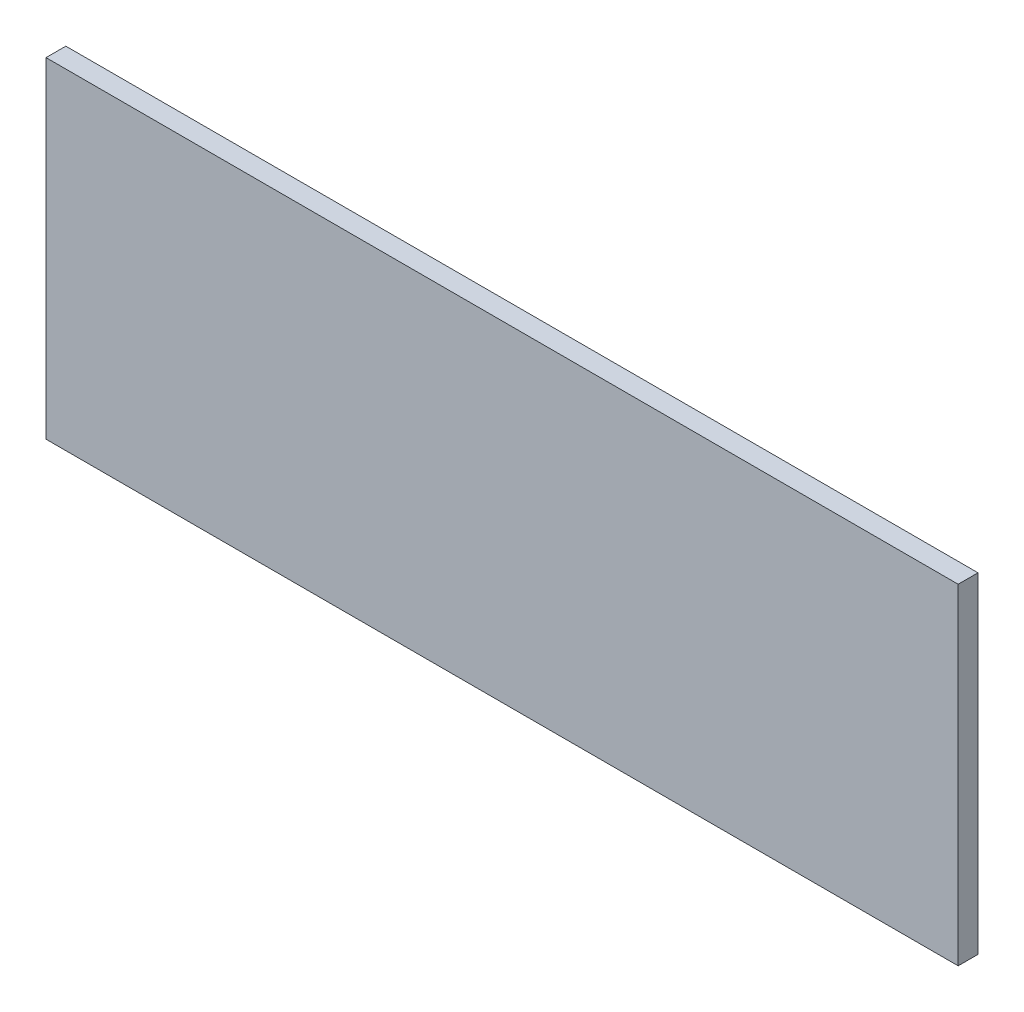
ISO-10303-21;
HEADER;
FILE_DESCRIPTION(('STEP AP214'),'2;1');
FILE_NAME('part.step','',(''),(''),'','','');
FILE_SCHEMA(('AUTOMOTIVE_DESIGN { 1 0 10303 214 1 1 1 1 }'));
ENDSEC;
DATA;
#1=APPLICATION_CONTEXT('core data for automotive mechanical design processes');
#2=APPLICATION_PROTOCOL_DEFINITION('international standard','automotive_design',2000,#1);
#3=PRODUCT_CONTEXT('',#1,'mechanical');
#4=PRODUCT('Part','Part','',(#3));
#5=PRODUCT_RELATED_PRODUCT_CATEGORY('part','',(#4));
#6=PRODUCT_DEFINITION_FORMATION('','',#4);
#7=PRODUCT_DEFINITION_CONTEXT('part definition',#1,'design');
#8=PRODUCT_DEFINITION('design','',#6,#7);
#9=PRODUCT_DEFINITION_SHAPE('','',#8);
#10=(LENGTH_UNIT() NAMED_UNIT(*) SI_UNIT(.MILLI.,.METRE.));
#11=(NAMED_UNIT(*) PLANE_ANGLE_UNIT() SI_UNIT($,.RADIAN.));
#12=(NAMED_UNIT(*) SI_UNIT($,.STERADIAN.) SOLID_ANGLE_UNIT());
#13=UNCERTAINTY_MEASURE_WITH_UNIT(LENGTH_MEASURE(1.E-05),#10,'distance_accuracy_value','');
#14=(GEOMETRIC_REPRESENTATION_CONTEXT(3) GLOBAL_UNCERTAINTY_ASSIGNED_CONTEXT((#13)) GLOBAL_UNIT_ASSIGNED_CONTEXT((#10,
#11,#12)) REPRESENTATION_CONTEXT('',''));
#15=CARTESIAN_POINT('',(0.,0.,0.));
#16=DIRECTION('',(0.,0.,1.));
#17=DIRECTION('',(1.,0.,0.));
#18=AXIS2_PLACEMENT_3D('',#15,#16,#17);
#19=CARTESIAN_POINT('',(690.,-250.,30.));
#20=DIRECTION('',(-1.,0.,0.));
#21=DIRECTION('',(0.,0.,1.));
#22=AXIS2_PLACEMENT_3D('',#19,#20,#21);
#23=PLANE('',#22);
#24=DIRECTION('',(0.,1.,0.));
#25=VECTOR('',#24,1.);
#26=CARTESIAN_POINT('',(690.,-250.,0.));
#27=LINE('',#26,#25);
#28=CARTESIAN_POINT('',(690.,-250.,0.));
#29=VERTEX_POINT('',#28);
#30=CARTESIAN_POINT('',(690.,250.,0.));
#31=VERTEX_POINT('',#30);
#32=EDGE_CURVE('E177',#29,#31,#27,.T.);
#33=ORIENTED_EDGE('',*,*,#32,.T.);
#34=DIRECTION('',(0.,0.,-1.));
#35=VECTOR('',#34,1.);
#36=CARTESIAN_POINT('',(690.,250.,30.));
#37=LINE('',#36,#35);
#38=CARTESIAN_POINT('',(690.,250.,30.));
#39=VERTEX_POINT('',#38);
#40=EDGE_CURVE('E11',#39,#31,#37,.T.);
#41=ORIENTED_EDGE('',*,*,#40,.F.);
#42=DIRECTION('',(0.,1.,0.));
#43=VECTOR('',#42,1.);
#44=CARTESIAN_POINT('',(690.,-250.,30.));
#45=LINE('',#44,#43);
#46=CARTESIAN_POINT('',(690.,-250.,30.));
#47=VERTEX_POINT('',#46);
#48=EDGE_CURVE('E166',#47,#39,#45,.T.);
#49=ORIENTED_EDGE('',*,*,#48,.F.);
#50=DIRECTION('',(0.,0.,-1.));
#51=VECTOR('',#50,1.);
#52=CARTESIAN_POINT('',(690.,-250.,30.));
#53=LINE('',#52,#51);
#54=EDGE_CURVE('E176',#47,#29,#53,.T.);
#55=ORIENTED_EDGE('',*,*,#54,.T.);
#56=EDGE_LOOP('',(#33,#41,#49,#55));
#57=FACE_BOUND('',#56,.T.);
#58=ADVANCED_FACE('F39',(#57),#23,.F.);
#59=CARTESIAN_POINT('',(-690.,250.,30.));
#60=DIRECTION('',(0.,-1.,0.));
#61=DIRECTION('',(0.,0.,-1.));
#62=AXIS2_PLACEMENT_3D('',#59,#60,#61);
#63=PLANE('',#62);
#64=DIRECTION('',(-1.,0.,0.));
#65=VECTOR('',#64,1.);
#66=CARTESIAN_POINT('',(-690.,250.,0.));
#67=LINE('',#66,#65);
#68=CARTESIAN_POINT('',(-690.,250.,0.));
#69=VERTEX_POINT('',#68);
#70=EDGE_CURVE('E181',#31,#69,#67,.T.);
#71=ORIENTED_EDGE('',*,*,#70,.T.);
#72=DIRECTION('',(0.,0.,-1.));
#73=VECTOR('',#72,1.);
#74=CARTESIAN_POINT('',(-690.,250.,30.));
#75=LINE('',#74,#73);
#76=CARTESIAN_POINT('',(-690.,250.,30.));
#77=VERTEX_POINT('',#76);
#78=EDGE_CURVE('E47',#77,#69,#75,.T.);
#79=ORIENTED_EDGE('',*,*,#78,.F.);
#80=DIRECTION('',(-1.,0.,0.));
#81=VECTOR('',#80,1.);
#82=CARTESIAN_POINT('',(-690.,250.,30.));
#83=LINE('',#82,#81);
#84=EDGE_CURVE('E91',#39,#77,#83,.T.);
#85=ORIENTED_EDGE('',*,*,#84,.F.);
#86=ORIENTED_EDGE('',*,*,#40,.T.);
#87=EDGE_LOOP('',(#71,#79,#85,#86));
#88=FACE_BOUND('',#87,.T.);
#89=ADVANCED_FACE('F216',(#88),#63,.F.);
#90=CARTESIAN_POINT('',(-690.,-250.,30.));
#91=DIRECTION('',(1.,0.,0.));
#92=DIRECTION('',(0.,0.,-1.));
#93=AXIS2_PLACEMENT_3D('',#90,#91,#92);
#94=PLANE('',#93);
#95=DIRECTION('',(0.,-1.,0.));
#96=VECTOR('',#95,1.);
#97=CARTESIAN_POINT('',(-690.,-250.,0.));
#98=LINE('',#97,#96);
#99=CARTESIAN_POINT('',(-690.,-250.,0.));
#100=VERTEX_POINT('',#99);
#101=EDGE_CURVE('E185',#69,#100,#98,.T.);
#102=ORIENTED_EDGE('',*,*,#101,.T.);
#103=DIRECTION('',(0.,0.,-1.));
#104=VECTOR('',#103,1.);
#105=CARTESIAN_POINT('',(-690.,-250.,30.));
#106=LINE('',#105,#104);
#107=CARTESIAN_POINT('',(-690.,-250.,30.));
#108=VERTEX_POINT('',#107);
#109=EDGE_CURVE('E192',#108,#100,#106,.T.);
#110=ORIENTED_EDGE('',*,*,#109,.F.);
#111=DIRECTION('',(0.,-1.,0.));
#112=VECTOR('',#111,1.);
#113=CARTESIAN_POINT('',(-690.,-250.,30.));
#114=LINE('',#113,#112);
#115=EDGE_CURVE('E171',#77,#108,#114,.T.);
#116=ORIENTED_EDGE('',*,*,#115,.F.);
#117=ORIENTED_EDGE('',*,*,#78,.T.);
#118=EDGE_LOOP('',(#102,#110,#116,#117));
#119=FACE_BOUND('',#118,.T.);
#120=ADVANCED_FACE('F199',(#119),#94,.F.);
#121=CARTESIAN_POINT('',(-690.,-250.,30.));
#122=DIRECTION('',(0.,1.,0.));
#123=DIRECTION('',(0.,0.,1.));
#124=AXIS2_PLACEMENT_3D('',#121,#122,#123);
#125=PLANE('',#124);
#126=DIRECTION('',(1.,0.,0.));
#127=VECTOR('',#126,1.);
#128=CARTESIAN_POINT('',(-690.,-250.,0.));
#129=LINE('',#128,#127);
#130=EDGE_CURVE('E84',#100,#29,#129,.T.);
#131=ORIENTED_EDGE('',*,*,#130,.T.);
#132=ORIENTED_EDGE('',*,*,#54,.F.);
#133=DIRECTION('',(1.,0.,0.));
#134=VECTOR('',#133,1.);
#135=CARTESIAN_POINT('',(-690.,-250.,30.));
#136=LINE('',#135,#134);
#137=EDGE_CURVE('E63',#108,#47,#136,.T.);
#138=ORIENTED_EDGE('',*,*,#137,.F.);
#139=ORIENTED_EDGE('',*,*,#109,.T.);
#140=EDGE_LOOP('',(#131,#132,#138,#139));
#141=FACE_BOUND('',#140,.T.);
#142=ADVANCED_FACE('F207',(#141),#125,.F.);
#143=CARTESIAN_POINT('',(0.,0.,30.));
#144=DIRECTION('',(0.,0.,-1.));
#145=DIRECTION('',(-1.,0.,0.));
#146=AXIS2_PLACEMENT_3D('',#143,#144,#145);
#147=PLANE('',#146);
#148=ORIENTED_EDGE('',*,*,#48,.T.);
#149=ORIENTED_EDGE('',*,*,#84,.T.);
#150=ORIENTED_EDGE('',*,*,#115,.T.);
#151=ORIENTED_EDGE('',*,*,#137,.T.);
#152=EDGE_LOOP('',(#148,#149,#150,#151));
#153=FACE_BOUND('',#152,.T.);
#154=ADVANCED_FACE('F209',(#153),#147,.F.);
#155=CARTESIAN_POINT('',(0.,0.,0.));
#156=DIRECTION('',(0.,0.,-1.));
#157=DIRECTION('',(-1.,0.,0.));
#158=AXIS2_PLACEMENT_3D('',#155,#156,#157);
#159=PLANE('',#158);
#160=CARTESIAN_POINT('',(256.532724234763,167.997980693588,0.));
#161=DIRECTION('',(0.,0.,-1.));
#162=DIRECTION('',(-1.,0.,0.));
#163=AXIS2_PLACEMENT_3D('',#160,#161,#162);
#164=CIRCLE('',#163,40.);
#165=CARTESIAN_POINT('',(216.532724234763,167.997980693588,0.));
#166=VERTEX_POINT('',#165);
#167=EDGE_CURVE('E143',#166,#166,#164,.T.);
#168=ORIENTED_EDGE('',*,*,#167,.F.);
#169=EDGE_LOOP('',(#168));
#170=FACE_BOUND('',#169,.T.);
#171=DIRECTION('',(0.,-1.,0.));
#172=VECTOR('',#171,1.);
#173=CARTESIAN_POINT('',(637.122165126967,-89.1309981056688,0.));
#174=LINE('',#173,#172);
#175=CARTESIAN_POINT('',(637.122165126967,207.869001894331,0.));
#176=VERTEX_POINT('',#175);
#177=CARTESIAN_POINT('',(637.122165126967,-89.1309981056688,0.));
#178=VERTEX_POINT('',#177);
#179=EDGE_CURVE('E54',#176,#178,#174,.T.);
#180=ORIENTED_EDGE('',*,*,#179,.F.);
#181=DIRECTION('',(1.,0.,0.));
#182=VECTOR('',#181,1.);
#183=CARTESIAN_POINT('',(427.122165126967,207.869001894331,0.));
#184=LINE('',#183,#182);
#185=CARTESIAN_POINT('',(427.122165126967,207.869001894331,0.));
#186=VERTEX_POINT('',#185);
#187=EDGE_CURVE('E136',#186,#176,#184,.T.);
#188=ORIENTED_EDGE('',*,*,#187,.F.);
#189=DIRECTION('',(0.,1.,0.));
#190=VECTOR('',#189,1.);
#191=CARTESIAN_POINT('',(427.122165126967,-89.1309981056688,0.));
#192=LINE('',#191,#190);
#193=CARTESIAN_POINT('',(427.122165126967,-89.1309981056688,0.));
#194=VERTEX_POINT('',#193);
#195=EDGE_CURVE('E140',#194,#186,#192,.T.);
#196=ORIENTED_EDGE('',*,*,#195,.F.);
#197=DIRECTION('',(-1.,0.,0.));
#198=VECTOR('',#197,1.);
#199=CARTESIAN_POINT('',(427.122165126967,-89.1309981056688,0.));
#200=LINE('',#199,#198);
#201=EDGE_CURVE('E152',#178,#194,#200,.T.);
#202=ORIENTED_EDGE('',*,*,#201,.F.);
#203=EDGE_LOOP('',(#180,#188,#196,#202));
#204=FACE_BOUND('',#203,.T.);
#205=ORIENTED_EDGE('',*,*,#32,.F.);
#206=ORIENTED_EDGE('',*,*,#130,.F.);
#207=ORIENTED_EDGE('',*,*,#101,.F.);
#208=ORIENTED_EDGE('',*,*,#70,.F.);
#209=EDGE_LOOP('',(#205,#206,#207,#208));
#210=FACE_BOUND('',#209,.T.);
#211=ADVANCED_FACE('F203',(#170,#204,#210),#159,.T.);
#212=CARTESIAN_POINT('',(637.122165126967,-89.1309981056688,10.));
#213=DIRECTION('',(1.,0.,0.));
#214=DIRECTION('',(0.,0.,-1.));
#215=AXIS2_PLACEMENT_3D('',#212,#213,#214);
#216=PLANE('',#215);
#217=ORIENTED_EDGE('',*,*,#179,.T.);
#218=DIRECTION('',(0.,0.,-1.));
#219=VECTOR('',#218,1.);
#220=CARTESIAN_POINT('',(637.122165126967,-89.1309981056688,10.));
#221=LINE('',#220,#219);
#222=CARTESIAN_POINT('',(637.122165126967,-89.1309981056688,10.));
#223=VERTEX_POINT('',#222);
#224=EDGE_CURVE('E111',#223,#178,#221,.T.);
#225=ORIENTED_EDGE('',*,*,#224,.F.);
#226=DIRECTION('',(0.,-1.,0.));
#227=VECTOR('',#226,1.);
#228=CARTESIAN_POINT('',(637.122165126967,-89.1309981056688,10.));
#229=LINE('',#228,#227);
#230=CARTESIAN_POINT('',(637.122165126967,207.869001894331,10.));
#231=VERTEX_POINT('',#230);
#232=EDGE_CURVE('E115',#231,#223,#229,.T.);
#233=ORIENTED_EDGE('',*,*,#232,.F.);
#234=DIRECTION('',(0.,0.,-1.));
#235=VECTOR('',#234,1.);
#236=CARTESIAN_POINT('',(637.122165126967,207.869001894331,10.));
#237=LINE('',#236,#235);
#238=EDGE_CURVE('E158',#231,#176,#237,.T.);
#239=ORIENTED_EDGE('',*,*,#238,.T.);
#240=EDGE_LOOP('',(#217,#225,#233,#239));
#241=FACE_BOUND('',#240,.T.);
#242=ADVANCED_FACE('F113',(#241),#216,.F.);
#243=CARTESIAN_POINT('',(427.122165126967,207.869001894331,10.));
#244=DIRECTION('',(0.,1.,0.));
#245=DIRECTION('',(-1.,0.,0.));
#246=AXIS2_PLACEMENT_3D('',#243,#244,#245);
#247=PLANE('',#246);
#248=ORIENTED_EDGE('',*,*,#187,.T.);
#249=ORIENTED_EDGE('',*,*,#238,.F.);
#250=DIRECTION('',(1.,0.,0.));
#251=VECTOR('',#250,1.);
#252=CARTESIAN_POINT('',(427.122165126967,207.869001894331,10.));
#253=LINE('',#252,#251);
#254=CARTESIAN_POINT('',(427.122165126967,207.869001894331,10.));
#255=VERTEX_POINT('',#254);
#256=EDGE_CURVE('E122',#255,#231,#253,.T.);
#257=ORIENTED_EDGE('',*,*,#256,.F.);
#258=DIRECTION('',(0.,0.,-1.));
#259=VECTOR('',#258,1.);
#260=CARTESIAN_POINT('',(427.122165126967,207.869001894331,10.));
#261=LINE('',#260,#259);
#262=EDGE_CURVE('E161',#255,#186,#261,.T.);
#263=ORIENTED_EDGE('',*,*,#262,.T.);
#264=EDGE_LOOP('',(#248,#249,#257,#263));
#265=FACE_BOUND('',#264,.T.);
#266=ADVANCED_FACE('F256',(#265),#247,.F.);
#267=CARTESIAN_POINT('',(427.122165126967,-89.1309981056688,10.));
#268=DIRECTION('',(-1.,0.,0.));
#269=DIRECTION('',(0.,0.,1.));
#270=AXIS2_PLACEMENT_3D('',#267,#268,#269);
#271=PLANE('',#270);
#272=ORIENTED_EDGE('',*,*,#195,.T.);
#273=ORIENTED_EDGE('',*,*,#262,.F.);
#274=DIRECTION('',(0.,1.,0.));
#275=VECTOR('',#274,1.);
#276=CARTESIAN_POINT('',(427.122165126967,-89.1309981056688,10.));
#277=LINE('',#276,#275);
#278=CARTESIAN_POINT('',(427.122165126967,-89.1309981056688,10.));
#279=VERTEX_POINT('',#278);
#280=EDGE_CURVE('E131',#279,#255,#277,.T.);
#281=ORIENTED_EDGE('',*,*,#280,.F.);
#282=DIRECTION('',(0.,0.,-1.));
#283=VECTOR('',#282,1.);
#284=CARTESIAN_POINT('',(427.122165126967,-89.1309981056688,10.));
#285=LINE('',#284,#283);
#286=EDGE_CURVE('E121',#279,#194,#285,.T.);
#287=ORIENTED_EDGE('',*,*,#286,.T.);
#288=EDGE_LOOP('',(#272,#273,#281,#287));
#289=FACE_BOUND('',#288,.T.);
#290=ADVANCED_FACE('F265',(#289),#271,.F.);
#291=CARTESIAN_POINT('',(427.122165126967,-89.1309981056688,10.));
#292=DIRECTION('',(0.,-1.,0.));
#293=DIRECTION('',(1.,0.,0.));
#294=AXIS2_PLACEMENT_3D('',#291,#292,#293);
#295=PLANE('',#294);
#296=ORIENTED_EDGE('',*,*,#201,.T.);
#297=ORIENTED_EDGE('',*,*,#286,.F.);
#298=DIRECTION('',(-1.,0.,0.));
#299=VECTOR('',#298,1.);
#300=CARTESIAN_POINT('',(427.122165126967,-89.1309981056688,10.));
#301=LINE('',#300,#299);
#302=EDGE_CURVE('E125',#223,#279,#301,.T.);
#303=ORIENTED_EDGE('',*,*,#302,.F.);
#304=ORIENTED_EDGE('',*,*,#224,.T.);
#305=EDGE_LOOP('',(#296,#297,#303,#304));
#306=FACE_BOUND('',#305,.T.);
#307=ADVANCED_FACE('F126',(#306),#295,.F.);
#308=CARTESIAN_POINT('',(0.,0.,10.));
#309=DIRECTION('',(0.,0.,-1.));
#310=DIRECTION('',(-1.,0.,0.));
#311=AXIS2_PLACEMENT_3D('',#308,#309,#310);
#312=PLANE('',#311);
#313=ORIENTED_EDGE('',*,*,#232,.T.);
#314=ORIENTED_EDGE('',*,*,#302,.T.);
#315=ORIENTED_EDGE('',*,*,#280,.T.);
#316=ORIENTED_EDGE('',*,*,#256,.T.);
#317=EDGE_LOOP('',(#313,#314,#315,#316));
#318=FACE_BOUND('',#317,.T.);
#319=ADVANCED_FACE('F133',(#318),#312,.T.);
#320=CARTESIAN_POINT('',(256.532724234763,167.997980693588,10.));
#321=DIRECTION('',(0.,0.,-1.));
#322=DIRECTION('',(-1.,0.,0.));
#323=AXIS2_PLACEMENT_3D('',#320,#321,#322);
#324=CYLINDRICAL_SURFACE('',#323,40.);
#325=CARTESIAN_POINT('',(256.532724234763,167.997980693588,10.));
#326=DIRECTION('',(0.,0.,-1.));
#327=DIRECTION('',(-1.,0.,0.));
#328=AXIS2_PLACEMENT_3D('',#325,#326,#327);
#329=CIRCLE('',#328,40.);
#330=CARTESIAN_POINT('',(216.532724234763,167.997980693588,10.));
#331=VERTEX_POINT('',#330);
#332=EDGE_CURVE('E182',#331,#331,#329,.T.);
#333=ORIENTED_EDGE('',*,*,#332,.F.);
#334=EDGE_LOOP('',(#333));
#335=FACE_BOUND('',#334,.T.);
#336=ORIENTED_EDGE('',*,*,#167,.T.);
#337=EDGE_LOOP('',(#336));
#338=FACE_BOUND('',#337,.T.);
#339=ADVANCED_FACE('F292',(#335,#338),#324,.F.);
#340=CARTESIAN_POINT('',(256.532724234763,167.997980693588,10.));
#341=DIRECTION('',(0.,0.,-1.));
#342=DIRECTION('',(-1.,0.,0.));
#343=AXIS2_PLACEMENT_3D('',#340,#341,#342);
#344=PLANE('',#343);
#345=ORIENTED_EDGE('',*,*,#332,.T.);
#346=EDGE_LOOP('',(#345));
#347=FACE_BOUND('',#346,.T.);
#348=ADVANCED_FACE('F301',(#347),#344,.T.);
#349=CLOSED_SHELL('',(#58,#89,#120,#142,#154,#211,#242,#266,#290,#307,#319,#339,#348));
#350=MANIFOLD_SOLID_BREP('B2',#349);
#351=ADVANCED_BREP_SHAPE_REPRESENTATION('',(#18,#350),#14);
#352=SHAPE_DEFINITION_REPRESENTATION(#9,#351);
ENDSEC;
END-ISO-10303-21;
